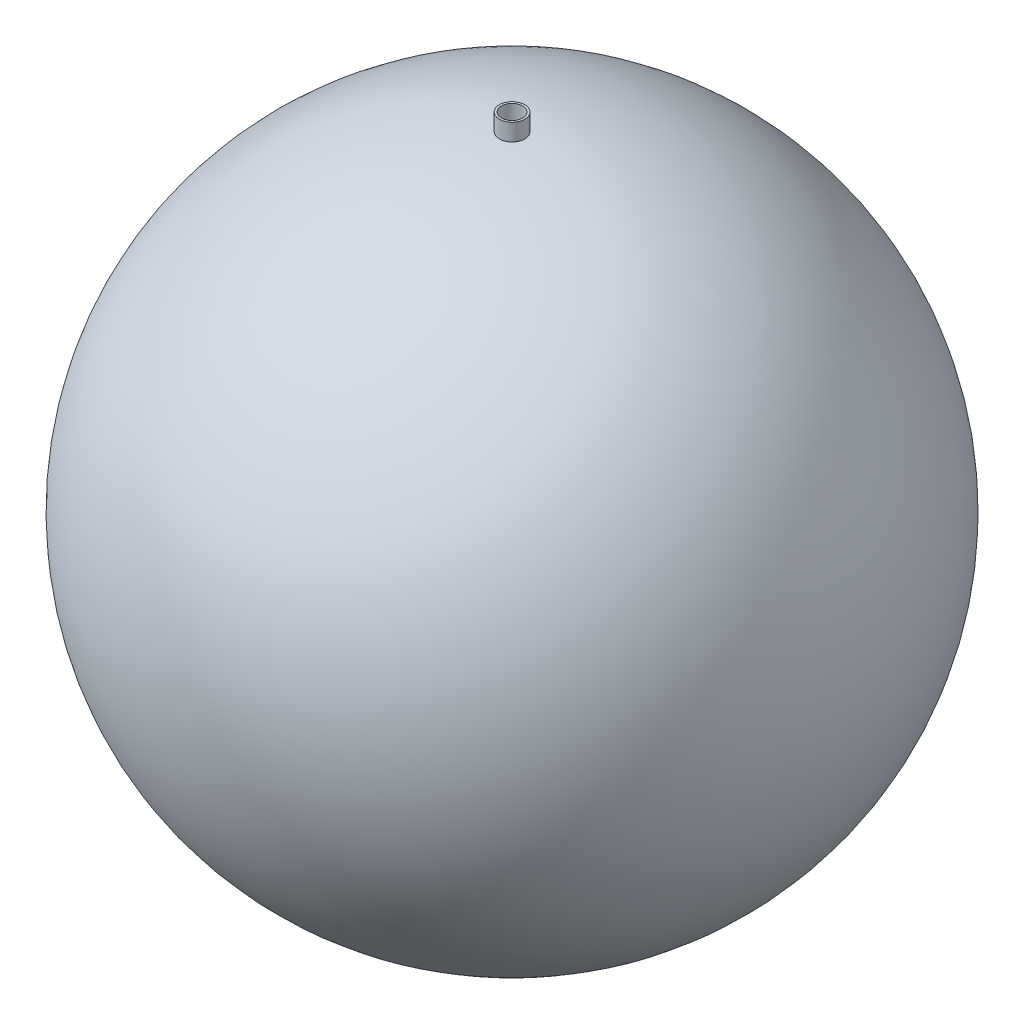
ISO-10303-21;
HEADER;
FILE_DESCRIPTION(('STEP AP214'),'2;1');
FILE_NAME('part.step','',(''),(''),'','','');
FILE_SCHEMA(('AUTOMOTIVE_DESIGN { 1 0 10303 214 1 1 1 1 }'));
ENDSEC;
DATA;
#1=APPLICATION_CONTEXT('core data for automotive mechanical design processes');
#2=APPLICATION_PROTOCOL_DEFINITION('international standard','automotive_design',2000,#1);
#3=PRODUCT_CONTEXT('',#1,'mechanical');
#4=PRODUCT('Part','Part','',(#3));
#5=PRODUCT_RELATED_PRODUCT_CATEGORY('part','',(#4));
#6=PRODUCT_DEFINITION_FORMATION('','',#4);
#7=PRODUCT_DEFINITION_CONTEXT('part definition',#1,'design');
#8=PRODUCT_DEFINITION('design','',#6,#7);
#9=PRODUCT_DEFINITION_SHAPE('','',#8);
#10=(LENGTH_UNIT() NAMED_UNIT(*) SI_UNIT(.MILLI.,.METRE.));
#11=(NAMED_UNIT(*) PLANE_ANGLE_UNIT() SI_UNIT($,.RADIAN.));
#12=(NAMED_UNIT(*) SI_UNIT($,.STERADIAN.) SOLID_ANGLE_UNIT());
#13=UNCERTAINTY_MEASURE_WITH_UNIT(LENGTH_MEASURE(1.E-05),#10,'distance_accuracy_value','');
#14=(GEOMETRIC_REPRESENTATION_CONTEXT(3) GLOBAL_UNCERTAINTY_ASSIGNED_CONTEXT((#13)) GLOBAL_UNIT_ASSIGNED_CONTEXT((#10,
#11,#12)) REPRESENTATION_CONTEXT('',''));
#15=CARTESIAN_POINT('',(0.,0.,0.));
#16=DIRECTION('',(0.,0.,1.));
#17=DIRECTION('',(1.,0.,0.));
#18=AXIS2_PLACEMENT_3D('',#15,#16,#17);
#19=CARTESIAN_POINT('',(0.,821.5925,0.));
#20=DIRECTION('',(0.,-1.,0.));
#21=DIRECTION('',(0.,0.,-1.));
#22=AXIS2_PLACEMENT_3D('',#19,#20,#21);
#23=CYLINDRICAL_SURFACE('',#22,30.);
#24=CARTESIAN_POINT('',(0.,781.016540193772,0.));
#25=DIRECTION('',(0.,-1.,0.));
#26=DIRECTION('',(0.,0.,-1.));
#27=AXIS2_PLACEMENT_3D('',#24,#25,#26);
#28=CIRCLE('',#27,30.);
#29=CARTESIAN_POINT('',(0.,781.016540193772,-30.));
#30=VERTEX_POINT('',#29);
#31=EDGE_CURVE('E10',#30,#30,#28,.T.);
#32=ORIENTED_EDGE('',*,*,#31,.F.);
#33=EDGE_LOOP('',(#32));
#34=FACE_BOUND('',#33,.T.);
#35=CARTESIAN_POINT('',(0.,821.5925,0.));
#36=DIRECTION('',(0.,1.,0.));
#37=DIRECTION('',(0.,0.,1.));
#38=AXIS2_PLACEMENT_3D('',#35,#36,#37);
#39=CIRCLE('',#38,30.);
#40=CARTESIAN_POINT('',(0.,821.5925,30.));
#41=VERTEX_POINT('',#40);
#42=EDGE_CURVE('E38',#41,#41,#39,.T.);
#43=ORIENTED_EDGE('',*,*,#42,.F.);
#44=EDGE_LOOP('',(#43));
#45=FACE_BOUND('',#44,.T.);
#46=ADVANCED_FACE('F30',(#34,#45),#23,.T.);
#47=CARTESIAN_POINT('',(0.,821.5925,0.));
#48=DIRECTION('',(0.,1.,0.));
#49=DIRECTION('',(0.,0.,1.));
#50=AXIS2_PLACEMENT_3D('',#47,#48,#49);
#51=PLANE('',#50);
#52=CARTESIAN_POINT('',(0.,821.5925,0.));
#53=DIRECTION('',(0.,1.,0.));
#54=DIRECTION('',(0.,0.,1.));
#55=AXIS2_PLACEMENT_3D('',#52,#53,#54);
#56=CIRCLE('',#55,25.);
#57=CARTESIAN_POINT('',(0.,821.5925,-25.));
#58=VERTEX_POINT('',#57);
#59=EDGE_CURVE('E44',#58,#58,#56,.T.);
#60=ORIENTED_EDGE('',*,*,#59,.F.);
#61=EDGE_LOOP('',(#60));
#62=FACE_BOUND('',#61,.T.);
#63=ORIENTED_EDGE('',*,*,#42,.T.);
#64=EDGE_LOOP('',(#63));
#65=FACE_BOUND('',#64,.T.);
#66=ADVANCED_FACE('F60',(#62,#65),#51,.T.);
#67=CARTESIAN_POINT('',(0.,0.,0.));
#68=DIRECTION('',(0.,-1.,0.));
#69=DIRECTION('',(-1.,0.,0.));
#70=AXIS2_PLACEMENT_3D('',#67,#68,#69);
#71=SPHERICAL_SURFACE('',#70,781.5925);
#72=ORIENTED_EDGE('',*,*,#31,.T.);
#73=EDGE_LOOP('',(#72));
#74=FACE_BOUND('',#73,.T.);
#75=ADVANCED_FACE('F32',(#74),#71,.T.);
#76=CARTESIAN_POINT('',(0.,821.5925,0.));
#77=DIRECTION('',(0.,-1.,0.));
#78=DIRECTION('',(0.,0.,-1.));
#79=AXIS2_PLACEMENT_3D('',#76,#77,#78);
#80=CYLINDRICAL_SURFACE('',#79,25.);
#81=CARTESIAN_POINT('',(0.,771.187387122125,0.));
#82=DIRECTION('',(0.,-1.,0.));
#83=DIRECTION('',(0.,0.,-1.));
#84=AXIS2_PLACEMENT_3D('',#81,#82,#83);
#85=CIRCLE('',#84,25.);
#86=CARTESIAN_POINT('',(0.,771.187387122125,-25.));
#87=VERTEX_POINT('',#86);
#88=EDGE_CURVE('E34',#87,#87,#85,.F.);
#89=CARTESIAN_POINT('',(0.,771.187387122125,-25.));
#90=CARTESIAN_POINT('',(0.,771.71244038127,-25.));
#91=CARTESIAN_POINT('',(0.,772.237493640414,-25.));
#92=CARTESIAN_POINT('',(0.,773.287600158703,-25.));
#93=CARTESIAN_POINT('',(0.,773.812653417848,-25.));
#94=CARTESIAN_POINT('',(0.,774.862759936137,-25.));
#95=CARTESIAN_POINT('',(0.,775.387813195281,-25.));
#96=CARTESIAN_POINT('',(0.,776.43791971357,-25.));
#97=CARTESIAN_POINT('',(0.,776.962972972715,-25.));
#98=CARTESIAN_POINT('',(0.,778.013079491004,-25.));
#99=CARTESIAN_POINT('',(0.,778.538132750149,-25.));
#100=CARTESIAN_POINT('',(0.,779.588239268438,-25.));
#101=CARTESIAN_POINT('',(0.,780.113292527582,-25.));
#102=CARTESIAN_POINT('',(0.,781.163399045871,-25.));
#103=CARTESIAN_POINT('',(0.,781.688452305016,-25.));
#104=CARTESIAN_POINT('',(0.,782.738558823305,-25.));
#105=CARTESIAN_POINT('',(0.,783.263612082449,-25.));
#106=CARTESIAN_POINT('',(0.,784.313718600738,-25.));
#107=CARTESIAN_POINT('',(0.,784.838771859883,-25.));
#108=CARTESIAN_POINT('',(0.,785.888878378172,-25.));
#109=CARTESIAN_POINT('',(0.,786.413931637316,-25.));
#110=CARTESIAN_POINT('',(0.,787.464038155606,-25.));
#111=CARTESIAN_POINT('',(0.,787.98909141475,-25.));
#112=CARTESIAN_POINT('',(0.,789.039197933039,-25.));
#113=CARTESIAN_POINT('',(0.,789.564251192184,-25.));
#114=CARTESIAN_POINT('',(0.,790.614357710473,-25.));
#115=CARTESIAN_POINT('',(0.,791.139410969617,-25.));
#116=CARTESIAN_POINT('',(0.,792.189517487906,-25.));
#117=CARTESIAN_POINT('',(0.,792.714570747051,-25.));
#118=CARTESIAN_POINT('',(0.,793.76467726534,-25.));
#119=CARTESIAN_POINT('',(0.,794.289730524484,-25.));
#120=CARTESIAN_POINT('',(0.,795.339837042773,-25.));
#121=CARTESIAN_POINT('',(0.,795.864890301918,-25.));
#122=CARTESIAN_POINT('',(0.,796.914996820207,-25.));
#123=CARTESIAN_POINT('',(0.,797.440050079352,-25.));
#124=CARTESIAN_POINT('',(0.,798.490156597641,-25.));
#125=CARTESIAN_POINT('',(0.,799.015209856785,-25.));
#126=CARTESIAN_POINT('',(0.,800.065316375074,-25.));
#127=CARTESIAN_POINT('',(0.,800.590369634219,-25.));
#128=CARTESIAN_POINT('',(0.,801.640476152508,-25.));
#129=CARTESIAN_POINT('',(0.,802.165529411652,-25.));
#130=CARTESIAN_POINT('',(0.,803.215635929941,-25.));
#131=CARTESIAN_POINT('',(0.,803.740689189086,-25.));
#132=CARTESIAN_POINT('',(0.,804.790795707375,-25.));
#133=CARTESIAN_POINT('',(0.,805.31584896652,-25.));
#134=CARTESIAN_POINT('',(0.,806.365955484809,-25.));
#135=CARTESIAN_POINT('',(0.,806.891008743953,-25.));
#136=CARTESIAN_POINT('',(0.,807.941115262242,-25.));
#137=CARTESIAN_POINT('',(0.,808.466168521387,-25.));
#138=CARTESIAN_POINT('',(0.,809.516275039676,-25.));
#139=CARTESIAN_POINT('',(0.,810.04132829882,-25.));
#140=CARTESIAN_POINT('',(0.,811.091434817109,-25.));
#141=CARTESIAN_POINT('',(0.,811.616488076254,-25.));
#142=CARTESIAN_POINT('',(0.,812.666594594543,-25.));
#143=CARTESIAN_POINT('',(0.,813.191647853688,-25.));
#144=CARTESIAN_POINT('',(0.,814.241754371977,-25.));
#145=CARTESIAN_POINT('',(0.,814.766807631121,-25.));
#146=CARTESIAN_POINT('',(0.,815.81691414941,-25.));
#147=CARTESIAN_POINT('',(0.,816.341967408555,-25.));
#148=CARTESIAN_POINT('',(0.,817.392073926844,-25.));
#149=CARTESIAN_POINT('',(0.,817.917127185988,-25.));
#150=CARTESIAN_POINT('',(0.,818.967233704277,-25.));
#151=CARTESIAN_POINT('',(0.,819.492286963422,-25.));
#152=CARTESIAN_POINT('',(0.,820.542393481711,-25.));
#153=CARTESIAN_POINT('',(0.,821.067446740856,-25.));
#154=CARTESIAN_POINT('',(0.,821.5925,-25.));
#155=B_SPLINE_CURVE_WITH_KNOTS('',3,(#89,#90,#91,#92,#93,#94,#95,#96,#97,#98,#99,#100,#101,#102,
#103,#104,#105,#106,#107,#108,#109,#110,#111,#112,#113,#114,#115,#116,#117,#118,#119,#120,#121,
#122,#123,#124,#125,#126,#127,#128,#129,#130,#131,#132,#133,#134,#135,#136,#137,#138,#139,#140,
#141,#142,#143,#144,#145,#146,#147,#148,#149,#150,#151,#152,#153,#154),.UNSPECIFIED.,.F.,.F.,(4,
2,2,2,2,2,2,2,2,2,2,2,2,2,2,2,2,2,2,2,2,2,2,2,2,2,2,2,2,2,2,2,4),(0.,1.57515977743361,
3.15031955486722,4.72547933230083,6.30063910973444,7.87579888716805,9.45095866460166,
11.0261184420352,12.6012782194688,14.1764379969024,15.751597774336,17.3267575517696,
18.9019173292032,20.4770771066367,22.0522368840703,23.6273966615039,25.2025564389375,
26.7777162163712,28.3528759938048,29.9280357712383,31.5031955486719,33.0783553261055,
34.6535151035391,36.2286748809727,37.8038346584063,39.3789944358399,40.9541542132734,
42.529313990707,44.1044737681406,45.6796335455742,47.2547933230079,48.8299531004415,
50.4051128778751),.UNSPECIFIED.);
#156=EDGE_CURVE('BSEAM53',#87,#58,#155,.T.);
#157=ORIENTED_EDGE('',*,*,#88,.F.);
#158=ORIENTED_EDGE('',*,*,#59,.T.);
#159=ORIENTED_EDGE('',*,*,#156,.T.);
#160=ORIENTED_EDGE('',*,*,#156,.F.);
#161=EDGE_LOOP('',(#157,#159,#158,#160));
#162=FACE_BOUND('',#161,.T.);
#163=ADVANCED_FACE('F53',(#162),#80,.F.);
#164=CARTESIAN_POINT('',(0.,0.,0.));
#165=DIRECTION('',(0.,-1.,0.));
#166=DIRECTION('',(1.,0.,0.));
#167=AXIS2_PLACEMENT_3D('',#164,#165,#166);
#168=SPHERICAL_SURFACE('',#167,771.5925);
#169=ORIENTED_EDGE('',*,*,#88,.T.);
#170=EDGE_LOOP('',(#169));
#171=FACE_BOUND('',#170,.T.);
#172=ADVANCED_FACE('F51',(#171),#168,.F.);
#173=CLOSED_SHELL('',(#46,#66,#75,#163,#172));
#174=MANIFOLD_SOLID_BREP('B2',#173);
#175=ADVANCED_BREP_SHAPE_REPRESENTATION('',(#18,#174),#14);
#176=SHAPE_DEFINITION_REPRESENTATION(#9,#175);
ENDSEC;
END-ISO-10303-21;
